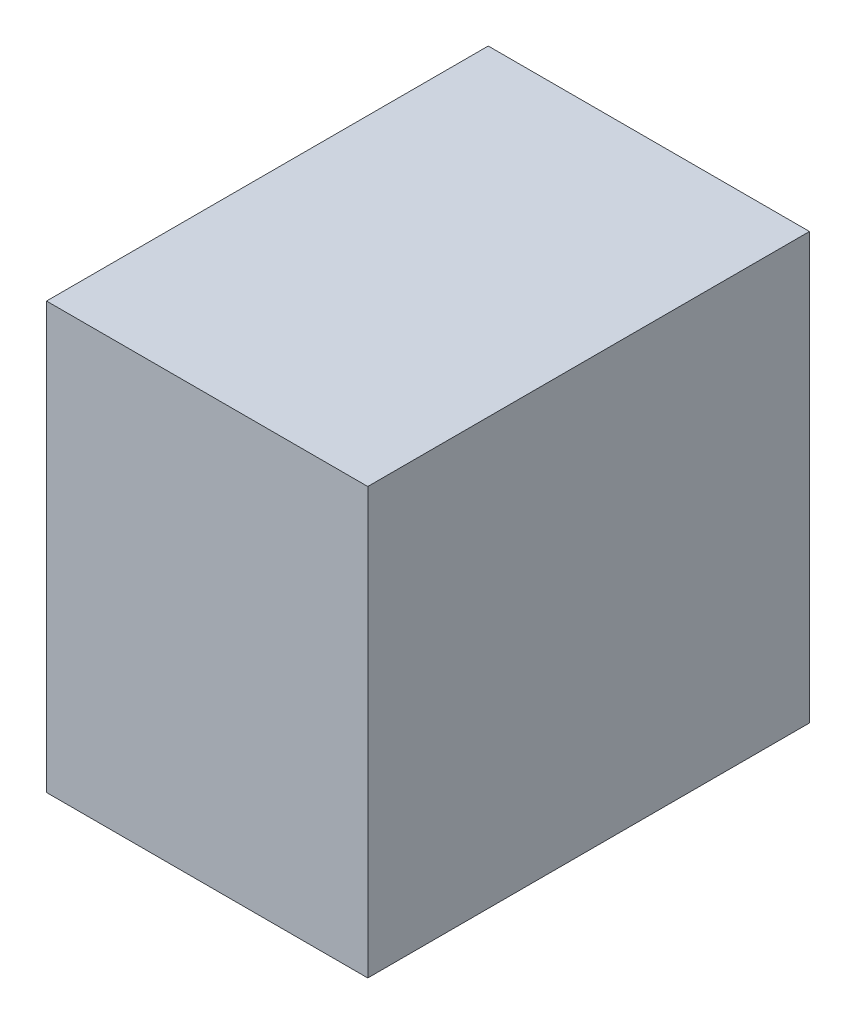
ISO-10303-21;
HEADER;
FILE_DESCRIPTION(('STEP AP214'),'2;1');
FILE_NAME('part.step','',(''),(''),'','','');
FILE_SCHEMA(('AUTOMOTIVE_DESIGN { 1 0 10303 214 1 1 1 1 }'));
ENDSEC;
DATA;
#1=APPLICATION_CONTEXT('core data for automotive mechanical design processes');
#2=APPLICATION_PROTOCOL_DEFINITION('international standard','automotive_design',2000,#1);
#3=PRODUCT_CONTEXT('',#1,'mechanical');
#4=PRODUCT('Part','Part','',(#3));
#5=PRODUCT_RELATED_PRODUCT_CATEGORY('part','',(#4));
#6=PRODUCT_DEFINITION_FORMATION('','',#4);
#7=PRODUCT_DEFINITION_CONTEXT('part definition',#1,'design');
#8=PRODUCT_DEFINITION('design','',#6,#7);
#9=PRODUCT_DEFINITION_SHAPE('','',#8);
#10=(LENGTH_UNIT() NAMED_UNIT(*) SI_UNIT(.MILLI.,.METRE.));
#11=(NAMED_UNIT(*) PLANE_ANGLE_UNIT() SI_UNIT($,.RADIAN.));
#12=(NAMED_UNIT(*) SI_UNIT($,.STERADIAN.) SOLID_ANGLE_UNIT());
#13=UNCERTAINTY_MEASURE_WITH_UNIT(LENGTH_MEASURE(1.E-05),#10,'distance_accuracy_value','');
#14=(GEOMETRIC_REPRESENTATION_CONTEXT(3) GLOBAL_UNCERTAINTY_ASSIGNED_CONTEXT((#13)) GLOBAL_UNIT_ASSIGNED_CONTEXT((#10,
#11,#12)) REPRESENTATION_CONTEXT('',''));
#15=CARTESIAN_POINT('',(0.,0.,0.));
#16=DIRECTION('',(0.,0.,1.));
#17=DIRECTION('',(1.,0.,0.));
#18=AXIS2_PLACEMENT_3D('',#15,#16,#17);
#19=CARTESIAN_POINT('',(-20.,53.,27.5));
#20=DIRECTION('',(1.,0.,0.));
#21=DIRECTION('',(0.,0.,-1.));
#22=AXIS2_PLACEMENT_3D('',#19,#20,#21);
#23=PLANE('',#22);
#24=DIRECTION('',(0.,0.,1.));
#25=VECTOR('',#24,1.);
#26=CARTESIAN_POINT('',(-20.,0.,27.5));
#27=LINE('',#26,#25);
#28=CARTESIAN_POINT('',(-20.,0.,-27.5));
#29=VERTEX_POINT('',#28);
#30=CARTESIAN_POINT('',(-20.,0.,27.5));
#31=VERTEX_POINT('',#30);
#32=EDGE_CURVE('E111',#29,#31,#27,.T.);
#33=ORIENTED_EDGE('',*,*,#32,.T.);
#34=DIRECTION('',(0.,-1.,0.));
#35=VECTOR('',#34,1.);
#36=CARTESIAN_POINT('',(-20.,53.,27.5));
#37=LINE('',#36,#35);
#38=CARTESIAN_POINT('',(-20.,53.,27.5));
#39=VERTEX_POINT('',#38);
#40=EDGE_CURVE('E11',#39,#31,#37,.T.);
#41=ORIENTED_EDGE('',*,*,#40,.F.);
#42=DIRECTION('',(0.,0.,1.));
#43=VECTOR('',#42,1.);
#44=CARTESIAN_POINT('',(-20.,53.,27.5));
#45=LINE('',#44,#43);
#46=CARTESIAN_POINT('',(-20.,53.,-27.5));
#47=VERTEX_POINT('',#46);
#48=EDGE_CURVE('E95',#47,#39,#45,.T.);
#49=ORIENTED_EDGE('',*,*,#48,.F.);
#50=DIRECTION('',(0.,-1.,0.));
#51=VECTOR('',#50,1.);
#52=CARTESIAN_POINT('',(-20.,53.,-27.5));
#53=LINE('',#52,#51);
#54=EDGE_CURVE('E107',#47,#29,#53,.T.);
#55=ORIENTED_EDGE('',*,*,#54,.T.);
#56=EDGE_LOOP('',(#33,#41,#49,#55));
#57=FACE_BOUND('',#56,.T.);
#58=ADVANCED_FACE('F43',(#57),#23,.F.);
#59=CARTESIAN_POINT('',(20.,53.,27.5));
#60=DIRECTION('',(0.,0.,-1.));
#61=DIRECTION('',(-1.,0.,0.));
#62=AXIS2_PLACEMENT_3D('',#59,#60,#61);
#63=PLANE('',#62);
#64=DIRECTION('',(1.,0.,0.));
#65=VECTOR('',#64,1.);
#66=CARTESIAN_POINT('',(20.,0.,27.5));
#67=LINE('',#66,#65);
#68=CARTESIAN_POINT('',(20.,0.,27.5));
#69=VERTEX_POINT('',#68);
#70=EDGE_CURVE('E100',#31,#69,#67,.T.);
#71=ORIENTED_EDGE('',*,*,#70,.T.);
#72=DIRECTION('',(0.,-1.,0.));
#73=VECTOR('',#72,1.);
#74=CARTESIAN_POINT('',(20.,53.,27.5));
#75=LINE('',#74,#73);
#76=CARTESIAN_POINT('',(20.,53.,27.5));
#77=VERTEX_POINT('',#76);
#78=EDGE_CURVE('E52',#77,#69,#75,.T.);
#79=ORIENTED_EDGE('',*,*,#78,.F.);
#80=DIRECTION('',(1.,0.,0.));
#81=VECTOR('',#80,1.);
#82=CARTESIAN_POINT('',(20.,53.,27.5));
#83=LINE('',#82,#81);
#84=EDGE_CURVE('E90',#39,#77,#83,.T.);
#85=ORIENTED_EDGE('',*,*,#84,.F.);
#86=ORIENTED_EDGE('',*,*,#40,.T.);
#87=EDGE_LOOP('',(#71,#79,#85,#86));
#88=FACE_BOUND('',#87,.T.);
#89=ADVANCED_FACE('F99',(#88),#63,.F.);
#90=CARTESIAN_POINT('',(20.,53.,27.5));
#91=DIRECTION('',(-1.,0.,0.));
#92=DIRECTION('',(0.,0.,1.));
#93=AXIS2_PLACEMENT_3D('',#90,#91,#92);
#94=PLANE('',#93);
#95=DIRECTION('',(0.,0.,-1.));
#96=VECTOR('',#95,1.);
#97=CARTESIAN_POINT('',(20.,0.,27.5));
#98=LINE('',#97,#96);
#99=CARTESIAN_POINT('',(20.,0.,-27.5));
#100=VERTEX_POINT('',#99);
#101=EDGE_CURVE('E77',#69,#100,#98,.T.);
#102=ORIENTED_EDGE('',*,*,#101,.T.);
#103=DIRECTION('',(0.,-1.,0.));
#104=VECTOR('',#103,1.);
#105=CARTESIAN_POINT('',(20.,53.,-27.5));
#106=LINE('',#105,#104);
#107=CARTESIAN_POINT('',(20.,53.,-27.5));
#108=VERTEX_POINT('',#107);
#109=EDGE_CURVE('E102',#108,#100,#106,.T.);
#110=ORIENTED_EDGE('',*,*,#109,.F.);
#111=DIRECTION('',(0.,0.,-1.));
#112=VECTOR('',#111,1.);
#113=CARTESIAN_POINT('',(20.,53.,27.5));
#114=LINE('',#113,#112);
#115=EDGE_CURVE('E93',#77,#108,#114,.T.);
#116=ORIENTED_EDGE('',*,*,#115,.F.);
#117=ORIENTED_EDGE('',*,*,#78,.T.);
#118=EDGE_LOOP('',(#102,#110,#116,#117));
#119=FACE_BOUND('',#118,.T.);
#120=ADVANCED_FACE('F103',(#119),#94,.F.);
#121=CARTESIAN_POINT('',(20.,53.,-27.5));
#122=DIRECTION('',(0.,0.,1.));
#123=DIRECTION('',(1.,0.,0.));
#124=AXIS2_PLACEMENT_3D('',#121,#122,#123);
#125=PLANE('',#124);
#126=DIRECTION('',(-1.,0.,0.));
#127=VECTOR('',#126,1.);
#128=CARTESIAN_POINT('',(20.,0.,-27.5));
#129=LINE('',#128,#127);
#130=EDGE_CURVE('E83',#100,#29,#129,.T.);
#131=ORIENTED_EDGE('',*,*,#130,.T.);
#132=ORIENTED_EDGE('',*,*,#54,.F.);
#133=DIRECTION('',(-1.,0.,0.));
#134=VECTOR('',#133,1.);
#135=CARTESIAN_POINT('',(20.,53.,-27.5));
#136=LINE('',#135,#134);
#137=EDGE_CURVE('E60',#108,#47,#136,.T.);
#138=ORIENTED_EDGE('',*,*,#137,.F.);
#139=ORIENTED_EDGE('',*,*,#109,.T.);
#140=EDGE_LOOP('',(#131,#132,#138,#139));
#141=FACE_BOUND('',#140,.T.);
#142=ADVANCED_FACE('F124',(#141),#125,.F.);
#143=CARTESIAN_POINT('',(0.,53.,0.));
#144=DIRECTION('',(0.,1.,0.));
#145=DIRECTION('',(0.,0.,1.));
#146=AXIS2_PLACEMENT_3D('',#143,#144,#145);
#147=PLANE('',#146);
#148=ORIENTED_EDGE('',*,*,#48,.T.);
#149=ORIENTED_EDGE('',*,*,#84,.T.);
#150=ORIENTED_EDGE('',*,*,#115,.T.);
#151=ORIENTED_EDGE('',*,*,#137,.T.);
#152=EDGE_LOOP('',(#148,#149,#150,#151));
#153=FACE_BOUND('',#152,.T.);
#154=ADVANCED_FACE('F91',(#153),#147,.T.);
#155=CARTESIAN_POINT('',(0.,0.,0.));
#156=DIRECTION('',(0.,1.,0.));
#157=DIRECTION('',(0.,0.,1.));
#158=AXIS2_PLACEMENT_3D('',#155,#156,#157);
#159=PLANE('',#158);
#160=ORIENTED_EDGE('',*,*,#32,.F.);
#161=ORIENTED_EDGE('',*,*,#130,.F.);
#162=ORIENTED_EDGE('',*,*,#101,.F.);
#163=ORIENTED_EDGE('',*,*,#70,.F.);
#164=EDGE_LOOP('',(#160,#161,#162,#163));
#165=FACE_BOUND('',#164,.T.);
#166=ADVANCED_FACE('F127',(#165),#159,.F.);
#167=CLOSED_SHELL('',(#58,#89,#120,#142,#154,#166));
#168=MANIFOLD_SOLID_BREP('B2',#167);
#169=ADVANCED_BREP_SHAPE_REPRESENTATION('',(#18,#168),#14);
#170=SHAPE_DEFINITION_REPRESENTATION(#9,#169);
ENDSEC;
END-ISO-10303-21;
